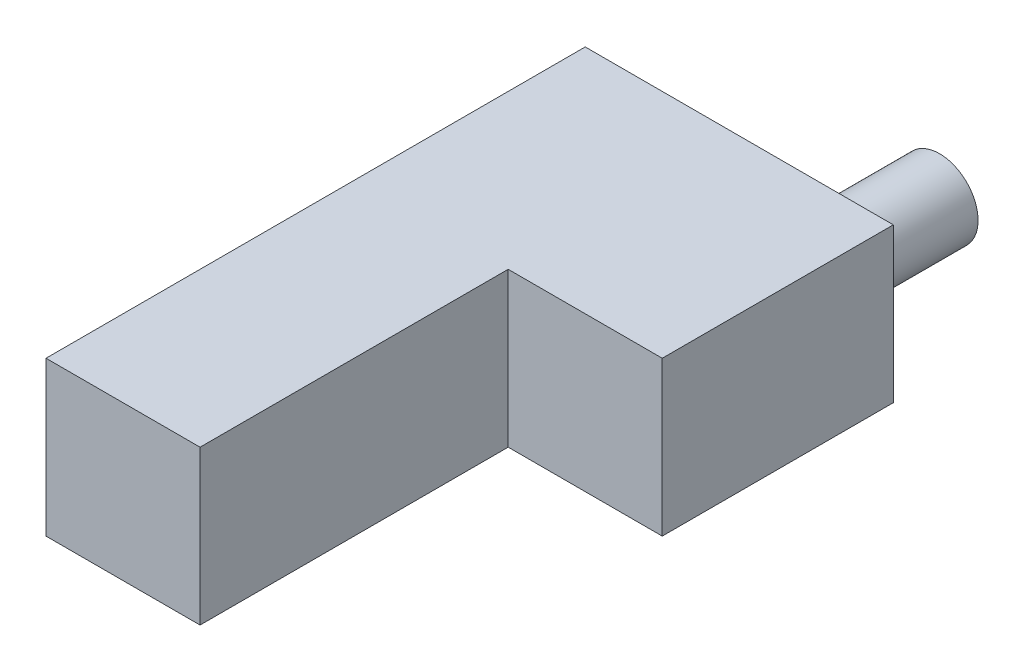
ISO-10303-21;
HEADER;
FILE_DESCRIPTION(('STEP AP214'),'2;1');
FILE_NAME('part.step','',(''),(''),'','','');
FILE_SCHEMA(('AUTOMOTIVE_DESIGN { 1 0 10303 214 1 1 1 1 }'));
ENDSEC;
DATA;
#1=APPLICATION_CONTEXT('core data for automotive mechanical design processes');
#2=APPLICATION_PROTOCOL_DEFINITION('international standard','automotive_design',2000,#1);
#3=PRODUCT_CONTEXT('',#1,'mechanical');
#4=PRODUCT('Part','Part','',(#3));
#5=PRODUCT_RELATED_PRODUCT_CATEGORY('part','',(#4));
#6=PRODUCT_DEFINITION_FORMATION('','',#4);
#7=PRODUCT_DEFINITION_CONTEXT('part definition',#1,'design');
#8=PRODUCT_DEFINITION('design','',#6,#7);
#9=PRODUCT_DEFINITION_SHAPE('','',#8);
#10=(LENGTH_UNIT() NAMED_UNIT(*) SI_UNIT(.MILLI.,.METRE.));
#11=(NAMED_UNIT(*) PLANE_ANGLE_UNIT() SI_UNIT($,.RADIAN.));
#12=(NAMED_UNIT(*) SI_UNIT($,.STERADIAN.) SOLID_ANGLE_UNIT());
#13=UNCERTAINTY_MEASURE_WITH_UNIT(LENGTH_MEASURE(1.E-05),#10,'distance_accuracy_value','');
#14=(GEOMETRIC_REPRESENTATION_CONTEXT(3) GLOBAL_UNCERTAINTY_ASSIGNED_CONTEXT((#13)) GLOBAL_UNIT_ASSIGNED_CONTEXT((#10,
#11,#12)) REPRESENTATION_CONTEXT('',''));
#15=CARTESIAN_POINT('',(0.,0.,0.));
#16=DIRECTION('',(0.,0.,1.));
#17=DIRECTION('',(1.,0.,0.));
#18=AXIS2_PLACEMENT_3D('',#15,#16,#17);
#19=CARTESIAN_POINT('',(-5.,10.,17.5));
#20=DIRECTION('',(-1.,0.,0.));
#21=DIRECTION('',(0.,0.,1.));
#22=AXIS2_PLACEMENT_3D('',#19,#20,#21);
#23=PLANE('',#22);
#24=DIRECTION('',(0.,0.,-1.));
#25=VECTOR('',#24,1.);
#26=CARTESIAN_POINT('',(-5.,0.,17.5));
#27=LINE('',#26,#25);
#28=CARTESIAN_POINT('',(-5.,0.,17.5));
#29=VERTEX_POINT('',#28);
#30=CARTESIAN_POINT('',(-5.,0.,-17.5));
#31=VERTEX_POINT('',#30);
#32=EDGE_CURVE('E127',#29,#31,#27,.T.);
#33=ORIENTED_EDGE('',*,*,#32,.F.);
#34=DIRECTION('',(0.,-1.,0.));
#35=VECTOR('',#34,1.);
#36=CARTESIAN_POINT('',(-5.,10.,17.5));
#37=LINE('',#36,#35);
#38=CARTESIAN_POINT('',(-5.,10.,17.5));
#39=VERTEX_POINT('',#38);
#40=EDGE_CURVE('E11',#39,#29,#37,.T.);
#41=ORIENTED_EDGE('',*,*,#40,.F.);
#42=DIRECTION('',(0.,0.,-1.));
#43=VECTOR('',#42,1.);
#44=CARTESIAN_POINT('',(-5.,10.,17.5));
#45=LINE('',#44,#43);
#46=CARTESIAN_POINT('',(-5.,10.,-17.5));
#47=VERTEX_POINT('',#46);
#48=EDGE_CURVE('E140',#39,#47,#45,.T.);
#49=ORIENTED_EDGE('',*,*,#48,.T.);
#50=DIRECTION('',(0.,-1.,0.));
#51=VECTOR('',#50,1.);
#52=CARTESIAN_POINT('',(-5.,10.,-17.5));
#53=LINE('',#52,#51);
#54=EDGE_CURVE('E44',#47,#31,#53,.T.);
#55=ORIENTED_EDGE('',*,*,#54,.T.);
#56=EDGE_LOOP('',(#33,#41,#49,#55));
#57=FACE_BOUND('',#56,.T.);
#58=ADVANCED_FACE('F41',(#57),#23,.T.);
#59=CARTESIAN_POINT('',(-5.,10.,17.5));
#60=DIRECTION('',(0.,0.,-1.));
#61=DIRECTION('',(-1.,0.,0.));
#62=AXIS2_PLACEMENT_3D('',#59,#60,#61);
#63=PLANE('',#62);
#64=DIRECTION('',(1.,0.,0.));
#65=VECTOR('',#64,1.);
#66=CARTESIAN_POINT('',(-5.,0.,17.5));
#67=LINE('',#66,#65);
#68=CARTESIAN_POINT('',(5.,0.,17.5));
#69=VERTEX_POINT('',#68);
#70=EDGE_CURVE('E80',#29,#69,#67,.T.);
#71=ORIENTED_EDGE('',*,*,#70,.T.);
#72=DIRECTION('',(0.,-1.,0.));
#73=VECTOR('',#72,1.);
#74=CARTESIAN_POINT('',(5.,10.,17.5));
#75=LINE('',#74,#73);
#76=CARTESIAN_POINT('',(5.,10.,17.5));
#77=VERTEX_POINT('',#76);
#78=EDGE_CURVE('E50',#77,#69,#75,.T.);
#79=ORIENTED_EDGE('',*,*,#78,.F.);
#80=DIRECTION('',(1.,0.,0.));
#81=VECTOR('',#80,1.);
#82=CARTESIAN_POINT('',(-5.,10.,17.5));
#83=LINE('',#82,#81);
#84=EDGE_CURVE('E105',#39,#77,#83,.T.);
#85=ORIENTED_EDGE('',*,*,#84,.F.);
#86=ORIENTED_EDGE('',*,*,#40,.T.);
#87=EDGE_LOOP('',(#71,#79,#85,#86));
#88=FACE_BOUND('',#87,.T.);
#89=ADVANCED_FACE('F176',(#88),#63,.F.);
#90=CARTESIAN_POINT('',(5.,10.,17.5));
#91=DIRECTION('',(-1.,0.,0.));
#92=DIRECTION('',(0.,0.,1.));
#93=AXIS2_PLACEMENT_3D('',#90,#91,#92);
#94=PLANE('',#93);
#95=DIRECTION('',(0.,0.,-1.));
#96=VECTOR('',#95,1.);
#97=CARTESIAN_POINT('',(5.,0.,17.5));
#98=LINE('',#97,#96);
#99=CARTESIAN_POINT('',(5.,0.,-2.50000000000001));
#100=VERTEX_POINT('',#99);
#101=EDGE_CURVE('E112',#69,#100,#98,.T.);
#102=ORIENTED_EDGE('',*,*,#101,.T.);
#103=DIRECTION('',(0.,-1.,0.));
#104=VECTOR('',#103,1.);
#105=CARTESIAN_POINT('',(5.,10.,-2.50000000000001));
#106=LINE('',#105,#104);
#107=CARTESIAN_POINT('',(5.,10.,-2.50000000000001));
#108=VERTEX_POINT('',#107);
#109=EDGE_CURVE('E109',#108,#100,#106,.T.);
#110=ORIENTED_EDGE('',*,*,#109,.F.);
#111=DIRECTION('',(0.,0.,-1.));
#112=VECTOR('',#111,1.);
#113=CARTESIAN_POINT('',(5.,10.,17.5));
#114=LINE('',#113,#112);
#115=EDGE_CURVE('E97',#77,#108,#114,.T.);
#116=ORIENTED_EDGE('',*,*,#115,.F.);
#117=ORIENTED_EDGE('',*,*,#78,.T.);
#118=EDGE_LOOP('',(#102,#110,#116,#117));
#119=FACE_BOUND('',#118,.T.);
#120=ADVANCED_FACE('F110',(#119),#94,.F.);
#121=CARTESIAN_POINT('',(5.,10.,-2.50000000000001));
#122=DIRECTION('',(0.,0.,-1.));
#123=DIRECTION('',(-1.,0.,0.));
#124=AXIS2_PLACEMENT_3D('',#121,#122,#123);
#125=PLANE('',#124);
#126=DIRECTION('',(1.,0.,0.));
#127=VECTOR('',#126,1.);
#128=CARTESIAN_POINT('',(5.,0.,-2.50000000000001));
#129=LINE('',#128,#127);
#130=CARTESIAN_POINT('',(15.,0.,-2.50000000000001));
#131=VERTEX_POINT('',#130);
#132=EDGE_CURVE('E137',#100,#131,#129,.T.);
#133=ORIENTED_EDGE('',*,*,#132,.T.);
#134=DIRECTION('',(0.,-1.,0.));
#135=VECTOR('',#134,1.);
#136=CARTESIAN_POINT('',(15.,10.,-2.50000000000001));
#137=LINE('',#136,#135);
#138=CARTESIAN_POINT('',(15.,10.,-2.50000000000001));
#139=VERTEX_POINT('',#138);
#140=EDGE_CURVE('E116',#139,#131,#137,.T.);
#141=ORIENTED_EDGE('',*,*,#140,.F.);
#142=DIRECTION('',(1.,0.,0.));
#143=VECTOR('',#142,1.);
#144=CARTESIAN_POINT('',(5.,10.,-2.50000000000001));
#145=LINE('',#144,#143);
#146=EDGE_CURVE('E103',#108,#139,#145,.T.);
#147=ORIENTED_EDGE('',*,*,#146,.F.);
#148=ORIENTED_EDGE('',*,*,#109,.T.);
#149=EDGE_LOOP('',(#133,#141,#147,#148));
#150=FACE_BOUND('',#149,.T.);
#151=ADVANCED_FACE('F118',(#150),#125,.F.);
#152=CARTESIAN_POINT('',(15.,10.,-17.5));
#153=DIRECTION('',(1.,0.,0.));
#154=DIRECTION('',(0.,0.,-1.));
#155=AXIS2_PLACEMENT_3D('',#152,#153,#154);
#156=PLANE('',#155);
#157=DIRECTION('',(0.,0.,1.));
#158=VECTOR('',#157,1.);
#159=CARTESIAN_POINT('',(15.,0.,-17.5));
#160=LINE('',#159,#158);
#161=CARTESIAN_POINT('',(15.,0.,-17.5));
#162=VERTEX_POINT('',#161);
#163=EDGE_CURVE('E134',#162,#131,#160,.T.);
#164=ORIENTED_EDGE('',*,*,#163,.F.);
#165=DIRECTION('',(0.,-1.,0.));
#166=VECTOR('',#165,1.);
#167=CARTESIAN_POINT('',(15.,10.,-17.5));
#168=LINE('',#167,#166);
#169=CARTESIAN_POINT('',(15.,10.,-17.5));
#170=VERTEX_POINT('',#169);
#171=EDGE_CURVE('E143',#170,#162,#168,.T.);
#172=ORIENTED_EDGE('',*,*,#171,.F.);
#173=DIRECTION('',(0.,0.,1.));
#174=VECTOR('',#173,1.);
#175=CARTESIAN_POINT('',(15.,10.,-17.5));
#176=LINE('',#175,#174);
#177=EDGE_CURVE('E120',#170,#139,#176,.T.);
#178=ORIENTED_EDGE('',*,*,#177,.T.);
#179=ORIENTED_EDGE('',*,*,#140,.T.);
#180=EDGE_LOOP('',(#164,#172,#178,#179));
#181=FACE_BOUND('',#180,.T.);
#182=ADVANCED_FACE('F149',(#181),#156,.T.);
#183=CARTESIAN_POINT('',(5.,10.,-17.5));
#184=DIRECTION('',(0.,0.,-1.));
#185=DIRECTION('',(-1.,0.,0.));
#186=AXIS2_PLACEMENT_3D('',#183,#184,#185);
#187=PLANE('',#186);
#188=CARTESIAN_POINT('',(10.,5.,-17.5));
#189=DIRECTION('',(0.,0.,-1.));
#190=DIRECTION('',(-1.,0.,0.));
#191=AXIS2_PLACEMENT_3D('',#188,#189,#190);
#192=CIRCLE('',#191,2.5);
#193=CARTESIAN_POINT('',(7.5,5.,-17.5));
#194=VERTEX_POINT('',#193);
#195=EDGE_CURVE('E152',#194,#194,#192,.T.);
#196=ORIENTED_EDGE('',*,*,#195,.F.);
#197=EDGE_LOOP('',(#196));
#198=FACE_BOUND('',#197,.T.);
#199=DIRECTION('',(1.,0.,0.));
#200=VECTOR('',#199,1.);
#201=CARTESIAN_POINT('',(5.,0.,-17.5));
#202=LINE('',#201,#200);
#203=EDGE_CURVE('E130',#31,#162,#202,.T.);
#204=ORIENTED_EDGE('',*,*,#203,.F.);
#205=ORIENTED_EDGE('',*,*,#54,.F.);
#206=DIRECTION('',(1.,0.,0.));
#207=VECTOR('',#206,1.);
#208=CARTESIAN_POINT('',(-5.,10.,-17.5));
#209=LINE('',#208,#207);
#210=EDGE_CURVE('E122',#47,#170,#209,.T.);
#211=ORIENTED_EDGE('',*,*,#210,.T.);
#212=ORIENTED_EDGE('',*,*,#171,.T.);
#213=EDGE_LOOP('',(#204,#205,#211,#212));
#214=FACE_BOUND('',#213,.T.);
#215=ADVANCED_FACE('F166',(#198,#214),#187,.T.);
#216=CARTESIAN_POINT('',(0.,10.,0.));
#217=DIRECTION('',(0.,-1.,0.));
#218=DIRECTION('',(0.,0.,-1.));
#219=AXIS2_PLACEMENT_3D('',#216,#217,#218);
#220=PLANE('',#219);
#221=ORIENTED_EDGE('',*,*,#48,.F.);
#222=ORIENTED_EDGE('',*,*,#84,.T.);
#223=ORIENTED_EDGE('',*,*,#115,.T.);
#224=ORIENTED_EDGE('',*,*,#146,.T.);
#225=ORIENTED_EDGE('',*,*,#177,.F.);
#226=ORIENTED_EDGE('',*,*,#210,.F.);
#227=EDGE_LOOP('',(#221,#222,#223,#224,#225,#226));
#228=FACE_BOUND('',#227,.T.);
#229=ADVANCED_FACE('F100',(#228),#220,.F.);
#230=CARTESIAN_POINT('',(0.,0.,0.));
#231=DIRECTION('',(0.,-1.,0.));
#232=DIRECTION('',(0.,0.,-1.));
#233=AXIS2_PLACEMENT_3D('',#230,#231,#232);
#234=PLANE('',#233);
#235=ORIENTED_EDGE('',*,*,#32,.T.);
#236=ORIENTED_EDGE('',*,*,#203,.T.);
#237=ORIENTED_EDGE('',*,*,#163,.T.);
#238=ORIENTED_EDGE('',*,*,#132,.F.);
#239=ORIENTED_EDGE('',*,*,#101,.F.);
#240=ORIENTED_EDGE('',*,*,#70,.F.);
#241=EDGE_LOOP('',(#235,#236,#237,#238,#239,#240));
#242=FACE_BOUND('',#241,.T.);
#243=ADVANCED_FACE('F147',(#242),#234,.T.);
#244=CARTESIAN_POINT('',(10.,5.,-25.5));
#245=DIRECTION('',(0.,0.,1.));
#246=DIRECTION('',(1.,0.,0.));
#247=AXIS2_PLACEMENT_3D('',#244,#245,#246);
#248=CYLINDRICAL_SURFACE('',#247,2.5);
#249=CARTESIAN_POINT('',(10.,5.,-25.5));
#250=DIRECTION('',(0.,0.,-1.));
#251=DIRECTION('',(-1.,0.,0.));
#252=AXIS2_PLACEMENT_3D('',#249,#250,#251);
#253=CIRCLE('',#252,2.5);
#254=CARTESIAN_POINT('',(7.5,5.,-25.5));
#255=VERTEX_POINT('',#254);
#256=EDGE_CURVE('E131',#255,#255,#253,.T.);
#257=ORIENTED_EDGE('',*,*,#256,.F.);
#258=EDGE_LOOP('',(#257));
#259=FACE_BOUND('',#258,.T.);
#260=ORIENTED_EDGE('',*,*,#195,.T.);
#261=EDGE_LOOP('',(#260));
#262=FACE_BOUND('',#261,.T.);
#263=ADVANCED_FACE('F160',(#259,#262),#248,.T.);
#264=CARTESIAN_POINT('',(10.,5.,-25.5));
#265=DIRECTION('',(0.,0.,-1.));
#266=DIRECTION('',(-1.,0.,0.));
#267=AXIS2_PLACEMENT_3D('',#264,#265,#266);
#268=PLANE('',#267);
#269=ORIENTED_EDGE('',*,*,#256,.T.);
#270=EDGE_LOOP('',(#269));
#271=FACE_BOUND('',#270,.T.);
#272=ADVANCED_FACE('F158',(#271),#268,.T.);
#273=CLOSED_SHELL('',(#58,#89,#120,#151,#182,#215,#229,#243,#263,#272));
#274=MANIFOLD_SOLID_BREP('B2',#273);
#275=ADVANCED_BREP_SHAPE_REPRESENTATION('',(#18,#274),#14);
#276=SHAPE_DEFINITION_REPRESENTATION(#9,#275);
ENDSEC;
END-ISO-10303-21;
